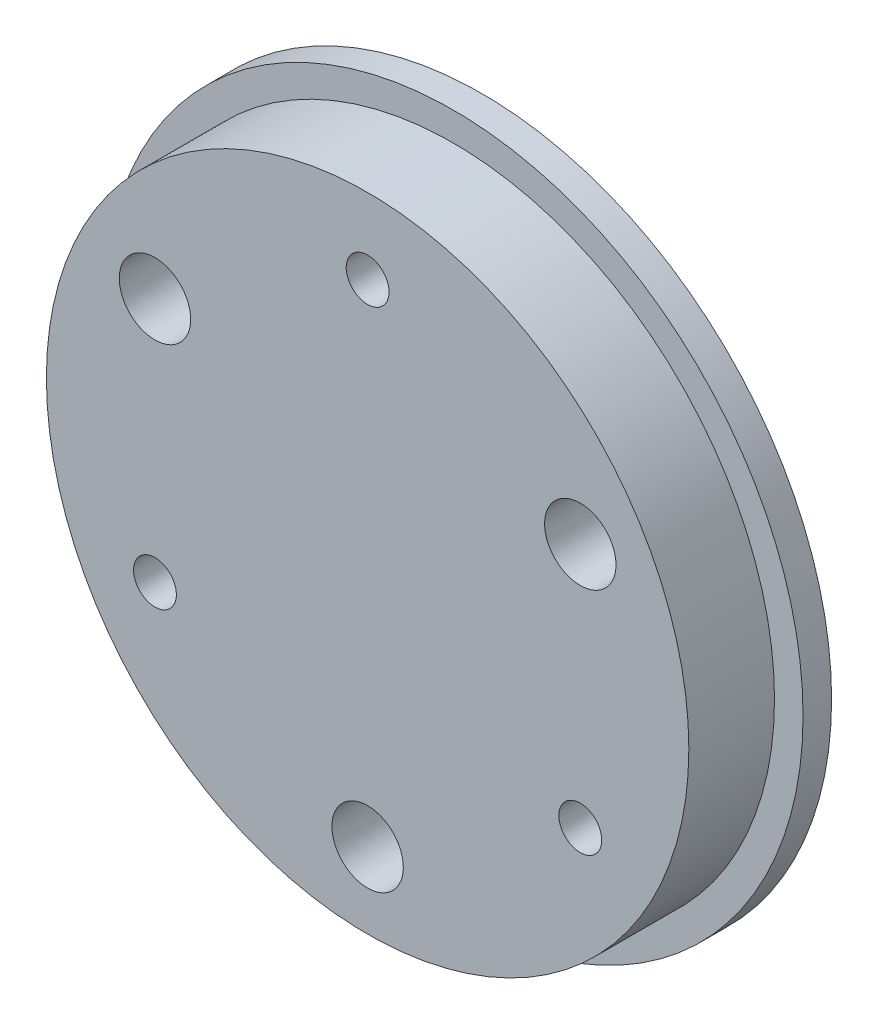
ISO-10303-21;
HEADER;
FILE_DESCRIPTION(('STEP AP214'),'2;1');
FILE_NAME('part.step','',(''),(''),'','','');
FILE_SCHEMA(('AUTOMOTIVE_DESIGN { 1 0 10303 214 1 1 1 1 }'));
ENDSEC;
DATA;
#1=APPLICATION_CONTEXT('core data for automotive mechanical design processes');
#2=APPLICATION_PROTOCOL_DEFINITION('international standard','automotive_design',2000,#1);
#3=PRODUCT_CONTEXT('',#1,'mechanical');
#4=PRODUCT('Part','Part','',(#3));
#5=PRODUCT_RELATED_PRODUCT_CATEGORY('part','',(#4));
#6=PRODUCT_DEFINITION_FORMATION('','',#4);
#7=PRODUCT_DEFINITION_CONTEXT('part definition',#1,'design');
#8=PRODUCT_DEFINITION('design','',#6,#7);
#9=PRODUCT_DEFINITION_SHAPE('','',#8);
#10=(LENGTH_UNIT() NAMED_UNIT(*) SI_UNIT(.MILLI.,.METRE.));
#11=(NAMED_UNIT(*) PLANE_ANGLE_UNIT() SI_UNIT($,.RADIAN.));
#12=(NAMED_UNIT(*) SI_UNIT($,.STERADIAN.) SOLID_ANGLE_UNIT());
#13=UNCERTAINTY_MEASURE_WITH_UNIT(LENGTH_MEASURE(1.E-05),#10,'distance_accuracy_value','');
#14=(GEOMETRIC_REPRESENTATION_CONTEXT(3) GLOBAL_UNCERTAINTY_ASSIGNED_CONTEXT((#13)) GLOBAL_UNIT_ASSIGNED_CONTEXT((#10,
#11,#12)) REPRESENTATION_CONTEXT('',''));
#15=CARTESIAN_POINT('',(0.,0.,0.));
#16=DIRECTION('',(0.,0.,1.));
#17=DIRECTION('',(1.,0.,0.));
#18=AXIS2_PLACEMENT_3D('',#15,#16,#17);
#19=CARTESIAN_POINT('',(0.,0.,2.));
#20=DIRECTION('',(0.,0.,-1.));
#21=DIRECTION('',(-1.,0.,0.));
#22=AXIS2_PLACEMENT_3D('',#19,#20,#21);
#23=CYLINDRICAL_SURFACE('',#22,24.5);
#24=CARTESIAN_POINT('',(0.,0.,2.));
#25=DIRECTION('',(0.,0.,1.));
#26=DIRECTION('',(1.,0.,0.));
#27=AXIS2_PLACEMENT_3D('',#24,#25,#26);
#28=CIRCLE('',#27,24.5);
#29=CARTESIAN_POINT('',(24.5,0.,2.));
#30=VERTEX_POINT('',#29);
#31=EDGE_CURVE('E10',#30,#30,#28,.T.);
#32=ORIENTED_EDGE('',*,*,#31,.F.);
#33=EDGE_LOOP('',(#32));
#34=FACE_BOUND('',#33,.T.);
#35=CARTESIAN_POINT('',(0.,0.,0.));
#36=DIRECTION('',(0.,0.,1.));
#37=DIRECTION('',(1.,0.,0.));
#38=AXIS2_PLACEMENT_3D('',#35,#36,#37);
#39=CIRCLE('',#38,24.5);
#40=CARTESIAN_POINT('',(24.5,0.,0.));
#41=VERTEX_POINT('',#40);
#42=EDGE_CURVE('E36',#41,#41,#39,.T.);
#43=ORIENTED_EDGE('',*,*,#42,.T.);
#44=EDGE_LOOP('',(#43));
#45=FACE_BOUND('',#44,.T.);
#46=ADVANCED_FACE('F33',(#34,#45),#23,.T.);
#47=CARTESIAN_POINT('',(0.,0.,2.));
#48=DIRECTION('',(0.,0.,1.));
#49=DIRECTION('',(1.,0.,0.));
#50=AXIS2_PLACEMENT_3D('',#47,#48,#49);
#51=PLANE('',#50);
#52=CARTESIAN_POINT('',(0.,0.,2.));
#53=DIRECTION('',(0.,0.,1.));
#54=DIRECTION('',(1.,0.,0.));
#55=AXIS2_PLACEMENT_3D('',#52,#53,#54);
#56=CIRCLE('',#55,22.5);
#57=CARTESIAN_POINT('',(22.5,0.,2.));
#58=VERTEX_POINT('',#57);
#59=EDGE_CURVE('E40',#58,#58,#56,.T.);
#60=ORIENTED_EDGE('',*,*,#59,.F.);
#61=EDGE_LOOP('',(#60));
#62=FACE_BOUND('',#61,.T.);
#63=ORIENTED_EDGE('',*,*,#31,.T.);
#64=EDGE_LOOP('',(#63));
#65=FACE_BOUND('',#64,.T.);
#66=ADVANCED_FACE('F116',(#62,#65),#51,.T.);
#67=CARTESIAN_POINT('',(0.,0.,0.));
#68=DIRECTION('',(0.,0.,1.));
#69=DIRECTION('',(1.,0.,0.));
#70=AXIS2_PLACEMENT_3D('',#67,#68,#69);
#71=PLANE('',#70);
#72=ORIENTED_EDGE('',*,*,#42,.F.);
#73=EDGE_LOOP('',(#72));
#74=FACE_BOUND('',#73,.T.);
#75=CARTESIAN_POINT('',(14.8956369450923,8.60000000000001,0.));
#76=DIRECTION('',(0.,0.,1.));
#77=DIRECTION('',(1.,0.,0.));
#78=AXIS2_PLACEMENT_3D('',#75,#76,#77);
#79=CIRCLE('',#78,2.49999999999999);
#80=CARTESIAN_POINT('',(17.3956369450923,8.60000000000001,0.));
#81=VERTEX_POINT('',#80);
#82=EDGE_CURVE('E62',#81,#81,#79,.T.);
#83=ORIENTED_EDGE('',*,*,#82,.T.);
#84=EDGE_LOOP('',(#83));
#85=FACE_BOUND('',#84,.T.);
#86=CARTESIAN_POINT('',(-14.8956369450923,8.6,0.));
#87=DIRECTION('',(0.,0.,1.));
#88=DIRECTION('',(1.,0.,0.));
#89=AXIS2_PLACEMENT_3D('',#86,#87,#88);
#90=CIRCLE('',#89,2.5);
#91=CARTESIAN_POINT('',(-12.3956369450923,8.6,0.));
#92=VERTEX_POINT('',#91);
#93=EDGE_CURVE('E59',#92,#92,#90,.T.);
#94=ORIENTED_EDGE('',*,*,#93,.T.);
#95=EDGE_LOOP('',(#94));
#96=FACE_BOUND('',#95,.T.);
#97=CARTESIAN_POINT('',(0.,-17.2,0.));
#98=DIRECTION('',(0.,0.,1.));
#99=DIRECTION('',(1.,0.,0.));
#100=AXIS2_PLACEMENT_3D('',#97,#98,#99);
#101=CIRCLE('',#100,2.5);
#102=CARTESIAN_POINT('',(2.5,-17.2,0.));
#103=VERTEX_POINT('',#102);
#104=EDGE_CURVE('E56',#103,#103,#101,.T.);
#105=ORIENTED_EDGE('',*,*,#104,.T.);
#106=EDGE_LOOP('',(#105));
#107=FACE_BOUND('',#106,.T.);
#108=CARTESIAN_POINT('',(-14.8956369450923,-8.60000000000001,0.));
#109=DIRECTION('',(0.,0.,1.));
#110=DIRECTION('',(1.,0.,0.));
#111=AXIS2_PLACEMENT_3D('',#108,#109,#110);
#112=CIRCLE('',#111,1.5);
#113=CARTESIAN_POINT('',(-13.3956369450923,-8.60000000000001,0.));
#114=VERTEX_POINT('',#113);
#115=EDGE_CURVE('E53',#114,#114,#112,.T.);
#116=ORIENTED_EDGE('',*,*,#115,.T.);
#117=EDGE_LOOP('',(#116));
#118=FACE_BOUND('',#117,.T.);
#119=CARTESIAN_POINT('',(14.8956369450923,-8.6,0.));
#120=DIRECTION('',(0.,0.,1.));
#121=DIRECTION('',(1.,0.,0.));
#122=AXIS2_PLACEMENT_3D('',#119,#120,#121);
#123=CIRCLE('',#122,1.5);
#124=CARTESIAN_POINT('',(16.3956369450923,-8.6,0.));
#125=VERTEX_POINT('',#124);
#126=EDGE_CURVE('E50',#125,#125,#123,.T.);
#127=ORIENTED_EDGE('',*,*,#126,.T.);
#128=EDGE_LOOP('',(#127));
#129=FACE_BOUND('',#128,.T.);
#130=CARTESIAN_POINT('',(0.,17.2,0.));
#131=DIRECTION('',(0.,0.,1.));
#132=DIRECTION('',(1.,0.,0.));
#133=AXIS2_PLACEMENT_3D('',#130,#131,#132);
#134=CIRCLE('',#133,1.5);
#135=CARTESIAN_POINT('',(1.5,17.2,0.));
#136=VERTEX_POINT('',#135);
#137=EDGE_CURVE('E46',#136,#136,#134,.T.);
#138=ORIENTED_EDGE('',*,*,#137,.T.);
#139=EDGE_LOOP('',(#138));
#140=FACE_BOUND('',#139,.T.);
#141=ADVANCED_FACE('F121',(#74,#85,#96,#107,#118,#129,#140),#71,.F.);
#142=CARTESIAN_POINT('',(0.,17.2,8.));
#143=DIRECTION('',(0.,0.,-1.));
#144=DIRECTION('',(-1.,0.,0.));
#145=AXIS2_PLACEMENT_3D('',#142,#143,#144);
#146=CYLINDRICAL_SURFACE('',#145,1.5);
#147=CARTESIAN_POINT('',(0.,17.2,8.));
#148=DIRECTION('',(0.,0.,1.));
#149=DIRECTION('',(1.,0.,0.));
#150=AXIS2_PLACEMENT_3D('',#147,#148,#149);
#151=CIRCLE('',#150,1.5);
#152=CARTESIAN_POINT('',(1.5,17.2,8.));
#153=VERTEX_POINT('',#152);
#154=EDGE_CURVE('E68',#153,#153,#151,.T.);
#155=ORIENTED_EDGE('',*,*,#154,.T.);
#156=EDGE_LOOP('',(#155));
#157=FACE_BOUND('',#156,.T.);
#158=ORIENTED_EDGE('',*,*,#137,.F.);
#159=EDGE_LOOP('',(#158));
#160=FACE_BOUND('',#159,.T.);
#161=ADVANCED_FACE('F130',(#157,#160),#146,.F.);
#162=CARTESIAN_POINT('',(14.8956369450923,-8.6,8.));
#163=DIRECTION('',(0.,0.,-1.));
#164=DIRECTION('',(-1.,0.,0.));
#165=AXIS2_PLACEMENT_3D('',#162,#163,#164);
#166=CYLINDRICAL_SURFACE('',#165,1.5);
#167=CARTESIAN_POINT('',(14.8956369450923,-8.6,8.));
#168=DIRECTION('',(0.,0.,1.));
#169=DIRECTION('',(1.,0.,0.));
#170=AXIS2_PLACEMENT_3D('',#167,#168,#169);
#171=CIRCLE('',#170,1.5);
#172=CARTESIAN_POINT('',(16.3956369450923,-8.6,8.));
#173=VERTEX_POINT('',#172);
#174=EDGE_CURVE('E71',#173,#173,#171,.T.);
#175=ORIENTED_EDGE('',*,*,#174,.T.);
#176=EDGE_LOOP('',(#175));
#177=FACE_BOUND('',#176,.T.);
#178=ORIENTED_EDGE('',*,*,#126,.F.);
#179=EDGE_LOOP('',(#178));
#180=FACE_BOUND('',#179,.T.);
#181=ADVANCED_FACE('F144',(#177,#180),#166,.F.);
#182=CARTESIAN_POINT('',(-14.8956369450923,-8.60000000000001,8.));
#183=DIRECTION('',(0.,0.,-1.));
#184=DIRECTION('',(-1.,0.,0.));
#185=AXIS2_PLACEMENT_3D('',#182,#183,#184);
#186=CYLINDRICAL_SURFACE('',#185,1.5);
#187=CARTESIAN_POINT('',(-14.8956369450923,-8.60000000000001,8.));
#188=DIRECTION('',(0.,0.,1.));
#189=DIRECTION('',(1.,0.,0.));
#190=AXIS2_PLACEMENT_3D('',#187,#188,#189);
#191=CIRCLE('',#190,1.5);
#192=CARTESIAN_POINT('',(-13.3956369450923,-8.60000000000001,8.));
#193=VERTEX_POINT('',#192);
#194=EDGE_CURVE('E74',#193,#193,#191,.T.);
#195=ORIENTED_EDGE('',*,*,#194,.T.);
#196=EDGE_LOOP('',(#195));
#197=FACE_BOUND('',#196,.T.);
#198=ORIENTED_EDGE('',*,*,#115,.F.);
#199=EDGE_LOOP('',(#198));
#200=FACE_BOUND('',#199,.T.);
#201=ADVANCED_FACE('F149',(#197,#200),#186,.F.);
#202=CARTESIAN_POINT('',(0.,-17.2,8.));
#203=DIRECTION('',(0.,0.,-1.));
#204=DIRECTION('',(-1.,0.,0.));
#205=AXIS2_PLACEMENT_3D('',#202,#203,#204);
#206=CYLINDRICAL_SURFACE('',#205,2.5);
#207=CARTESIAN_POINT('',(0.,-17.2,8.));
#208=DIRECTION('',(0.,0.,1.));
#209=DIRECTION('',(1.,0.,0.));
#210=AXIS2_PLACEMENT_3D('',#207,#208,#209);
#211=CIRCLE('',#210,2.5);
#212=CARTESIAN_POINT('',(2.5,-17.2,8.));
#213=VERTEX_POINT('',#212);
#214=EDGE_CURVE('E77',#213,#213,#211,.T.);
#215=ORIENTED_EDGE('',*,*,#214,.T.);
#216=EDGE_LOOP('',(#215));
#217=FACE_BOUND('',#216,.T.);
#218=ORIENTED_EDGE('',*,*,#104,.F.);
#219=EDGE_LOOP('',(#218));
#220=FACE_BOUND('',#219,.T.);
#221=ADVANCED_FACE('F155',(#217,#220),#206,.F.);
#222=CARTESIAN_POINT('',(-14.8956369450923,8.6,8.));
#223=DIRECTION('',(0.,0.,-1.));
#224=DIRECTION('',(-1.,0.,0.));
#225=AXIS2_PLACEMENT_3D('',#222,#223,#224);
#226=CYLINDRICAL_SURFACE('',#225,2.5);
#227=CARTESIAN_POINT('',(-14.8956369450923,8.6,8.));
#228=DIRECTION('',(0.,0.,1.));
#229=DIRECTION('',(1.,0.,0.));
#230=AXIS2_PLACEMENT_3D('',#227,#228,#229);
#231=CIRCLE('',#230,2.5);
#232=CARTESIAN_POINT('',(-12.3956369450923,8.6,8.));
#233=VERTEX_POINT('',#232);
#234=EDGE_CURVE('E80',#233,#233,#231,.T.);
#235=ORIENTED_EDGE('',*,*,#234,.T.);
#236=EDGE_LOOP('',(#235));
#237=FACE_BOUND('',#236,.T.);
#238=ORIENTED_EDGE('',*,*,#93,.F.);
#239=EDGE_LOOP('',(#238));
#240=FACE_BOUND('',#239,.T.);
#241=ADVANCED_FACE('F112',(#237,#240),#226,.F.);
#242=CARTESIAN_POINT('',(14.8956369450923,8.60000000000001,8.));
#243=DIRECTION('',(0.,0.,-1.));
#244=DIRECTION('',(-1.,0.,0.));
#245=AXIS2_PLACEMENT_3D('',#242,#243,#244);
#246=CYLINDRICAL_SURFACE('',#245,2.49999999999999);
#247=CARTESIAN_POINT('',(14.8956369450923,8.60000000000001,8.));
#248=DIRECTION('',(0.,0.,1.));
#249=DIRECTION('',(1.,0.,0.));
#250=AXIS2_PLACEMENT_3D('',#247,#248,#249);
#251=CIRCLE('',#250,2.49999999999999);
#252=CARTESIAN_POINT('',(17.3956369450923,8.60000000000001,8.));
#253=VERTEX_POINT('',#252);
#254=EDGE_CURVE('E49',#253,#253,#251,.T.);
#255=ORIENTED_EDGE('',*,*,#254,.T.);
#256=EDGE_LOOP('',(#255));
#257=FACE_BOUND('',#256,.T.);
#258=ORIENTED_EDGE('',*,*,#82,.F.);
#259=EDGE_LOOP('',(#258));
#260=FACE_BOUND('',#259,.T.);
#261=ADVANCED_FACE('F86',(#257,#260),#246,.F.);
#262=CARTESIAN_POINT('',(0.,0.,8.));
#263=DIRECTION('',(0.,0.,-1.));
#264=DIRECTION('',(-1.,0.,0.));
#265=AXIS2_PLACEMENT_3D('',#262,#263,#264);
#266=CYLINDRICAL_SURFACE('',#265,22.5);
#267=ORIENTED_EDGE('',*,*,#59,.T.);
#268=EDGE_LOOP('',(#267));
#269=FACE_BOUND('',#268,.T.);
#270=CARTESIAN_POINT('',(0.,0.,8.));
#271=DIRECTION('',(0.,0.,1.));
#272=DIRECTION('',(1.,0.,0.));
#273=AXIS2_PLACEMENT_3D('',#270,#271,#272);
#274=CIRCLE('',#273,22.5);
#275=CARTESIAN_POINT('',(22.5,0.,8.));
#276=VERTEX_POINT('',#275);
#277=EDGE_CURVE('E65',#276,#276,#274,.T.);
#278=ORIENTED_EDGE('',*,*,#277,.F.);
#279=EDGE_LOOP('',(#278));
#280=FACE_BOUND('',#279,.T.);
#281=ADVANCED_FACE('F92',(#269,#280),#266,.T.);
#282=CARTESIAN_POINT('',(0.,0.,8.));
#283=DIRECTION('',(0.,0.,1.));
#284=DIRECTION('',(1.,0.,0.));
#285=AXIS2_PLACEMENT_3D('',#282,#283,#284);
#286=PLANE('',#285);
#287=ORIENTED_EDGE('',*,*,#254,.F.);
#288=EDGE_LOOP('',(#287));
#289=FACE_BOUND('',#288,.T.);
#290=ORIENTED_EDGE('',*,*,#234,.F.);
#291=EDGE_LOOP('',(#290));
#292=FACE_BOUND('',#291,.T.);
#293=ORIENTED_EDGE('',*,*,#214,.F.);
#294=EDGE_LOOP('',(#293));
#295=FACE_BOUND('',#294,.T.);
#296=ORIENTED_EDGE('',*,*,#194,.F.);
#297=EDGE_LOOP('',(#296));
#298=FACE_BOUND('',#297,.T.);
#299=ORIENTED_EDGE('',*,*,#174,.F.);
#300=EDGE_LOOP('',(#299));
#301=FACE_BOUND('',#300,.T.);
#302=ORIENTED_EDGE('',*,*,#154,.F.);
#303=EDGE_LOOP('',(#302));
#304=FACE_BOUND('',#303,.T.);
#305=ORIENTED_EDGE('',*,*,#277,.T.);
#306=EDGE_LOOP('',(#305));
#307=FACE_BOUND('',#306,.T.);
#308=ADVANCED_FACE('F89',(#289,#292,#295,#298,#301,#304,#307),#286,.T.);
#309=CLOSED_SHELL('',(#46,#66,#141,#161,#181,#201,#221,#241,#261,#281,#308));
#310=MANIFOLD_SOLID_BREP('B2',#309);
#311=ADVANCED_BREP_SHAPE_REPRESENTATION('',(#18,#310),#14);
#312=SHAPE_DEFINITION_REPRESENTATION(#9,#311);
ENDSEC;
END-ISO-10303-21;
